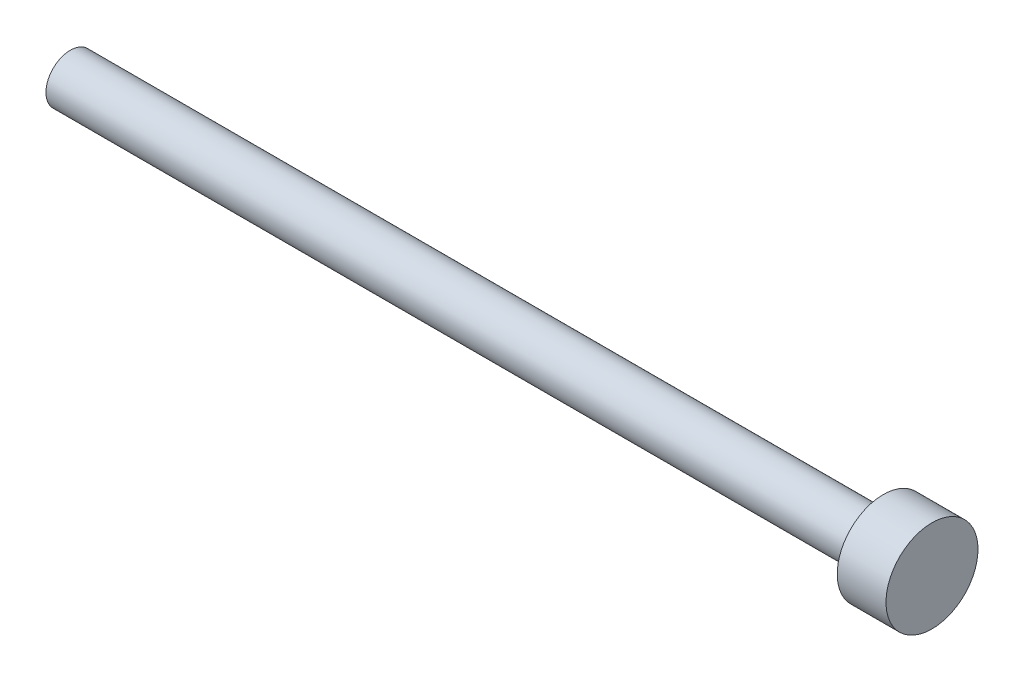
ISO-10303-21;
HEADER;
FILE_DESCRIPTION(('STEP AP214'),'2;1');
FILE_NAME('part.step','',(''),(''),'','','');
FILE_SCHEMA(('AUTOMOTIVE_DESIGN { 1 0 10303 214 1 1 1 1 }'));
ENDSEC;
DATA;
#1=APPLICATION_CONTEXT('core data for automotive mechanical design processes');
#2=APPLICATION_PROTOCOL_DEFINITION('international standard','automotive_design',2000,#1);
#3=PRODUCT_CONTEXT('',#1,'mechanical');
#4=PRODUCT('Part','Part','',(#3));
#5=PRODUCT_RELATED_PRODUCT_CATEGORY('part','',(#4));
#6=PRODUCT_DEFINITION_FORMATION('','',#4);
#7=PRODUCT_DEFINITION_CONTEXT('part definition',#1,'design');
#8=PRODUCT_DEFINITION('design','',#6,#7);
#9=PRODUCT_DEFINITION_SHAPE('','',#8);
#10=(LENGTH_UNIT() NAMED_UNIT(*) SI_UNIT(.MILLI.,.METRE.));
#11=(NAMED_UNIT(*) PLANE_ANGLE_UNIT() SI_UNIT($,.RADIAN.));
#12=(NAMED_UNIT(*) SI_UNIT($,.STERADIAN.) SOLID_ANGLE_UNIT());
#13=UNCERTAINTY_MEASURE_WITH_UNIT(LENGTH_MEASURE(1.E-05),#10,'distance_accuracy_value','');
#14=(GEOMETRIC_REPRESENTATION_CONTEXT(3) GLOBAL_UNCERTAINTY_ASSIGNED_CONTEXT((#13)) GLOBAL_UNIT_ASSIGNED_CONTEXT((#10,
#11,#12)) REPRESENTATION_CONTEXT('',''));
#15=CARTESIAN_POINT('',(0.,0.,0.));
#16=DIRECTION('',(0.,0.,1.));
#17=DIRECTION('',(1.,0.,0.));
#18=AXIS2_PLACEMENT_3D('',#15,#16,#17);
#19=CARTESIAN_POINT('',(50.,0.,0.));
#20=DIRECTION('',(-1.,0.,0.));
#21=DIRECTION('',(0.,0.,1.));
#22=AXIS2_PLACEMENT_3D('',#19,#20,#21);
#23=CYLINDRICAL_SURFACE('',#22,1.5);
#24=CARTESIAN_POINT('',(50.,0.,0.));
#25=DIRECTION('',(1.,0.,0.));
#26=DIRECTION('',(0.,0.,-1.));
#27=AXIS2_PLACEMENT_3D('',#24,#25,#26);
#28=CIRCLE('',#27,1.5);
#29=CARTESIAN_POINT('',(50.,0.,-1.5));
#30=VERTEX_POINT('',#29);
#31=EDGE_CURVE('E10',#30,#30,#28,.T.);
#32=ORIENTED_EDGE('',*,*,#31,.F.);
#33=EDGE_LOOP('',(#32));
#34=FACE_BOUND('',#33,.T.);
#35=CARTESIAN_POINT('',(0.,0.,0.));
#36=DIRECTION('',(1.,0.,0.));
#37=DIRECTION('',(0.,0.,-1.));
#38=AXIS2_PLACEMENT_3D('',#35,#36,#37);
#39=CIRCLE('',#38,1.5);
#40=CARTESIAN_POINT('',(0.,0.,-1.5));
#41=VERTEX_POINT('',#40);
#42=EDGE_CURVE('E38',#41,#41,#39,.T.);
#43=ORIENTED_EDGE('',*,*,#42,.T.);
#44=EDGE_LOOP('',(#43));
#45=FACE_BOUND('',#44,.T.);
#46=ADVANCED_FACE('F35',(#34,#45),#23,.T.);
#47=CARTESIAN_POINT('',(0.,0.,0.));
#48=DIRECTION('',(1.,0.,0.));
#49=DIRECTION('',(0.,0.,-1.));
#50=AXIS2_PLACEMENT_3D('',#47,#48,#49);
#51=PLANE('',#50);
#52=ORIENTED_EDGE('',*,*,#42,.F.);
#53=EDGE_LOOP('',(#52));
#54=FACE_BOUND('',#53,.T.);
#55=ADVANCED_FACE('F58',(#54),#51,.F.);
#56=CARTESIAN_POINT('',(53.,0.,0.));
#57=DIRECTION('',(-1.,0.,0.));
#58=DIRECTION('',(0.,0.,1.));
#59=AXIS2_PLACEMENT_3D('',#56,#57,#58);
#60=CYLINDRICAL_SURFACE('',#59,2.83);
#61=CARTESIAN_POINT('',(53.,0.,0.));
#62=DIRECTION('',(1.,0.,0.));
#63=DIRECTION('',(0.,0.,-1.));
#64=AXIS2_PLACEMENT_3D('',#61,#62,#63);
#65=CIRCLE('',#64,2.83);
#66=CARTESIAN_POINT('',(53.,0.,-2.83));
#67=VERTEX_POINT('',#66);
#68=EDGE_CURVE('E45',#67,#67,#65,.T.);
#69=ORIENTED_EDGE('',*,*,#68,.F.);
#70=EDGE_LOOP('',(#69));
#71=FACE_BOUND('',#70,.T.);
#72=CARTESIAN_POINT('',(50.,0.,0.));
#73=DIRECTION('',(1.,0.,0.));
#74=DIRECTION('',(0.,0.,-1.));
#75=AXIS2_PLACEMENT_3D('',#72,#73,#74);
#76=CIRCLE('',#75,2.83);
#77=CARTESIAN_POINT('',(50.,0.,-2.83));
#78=VERTEX_POINT('',#77);
#79=EDGE_CURVE('E47',#78,#78,#76,.T.);
#80=ORIENTED_EDGE('',*,*,#79,.T.);
#81=EDGE_LOOP('',(#80));
#82=FACE_BOUND('',#81,.T.);
#83=ADVANCED_FACE('F55',(#71,#82),#60,.T.);
#84=CARTESIAN_POINT('',(53.,0.,0.));
#85=DIRECTION('',(1.,0.,0.));
#86=DIRECTION('',(0.,0.,-1.));
#87=AXIS2_PLACEMENT_3D('',#84,#85,#86);
#88=PLANE('',#87);
#89=ORIENTED_EDGE('',*,*,#68,.T.);
#90=EDGE_LOOP('',(#89));
#91=FACE_BOUND('',#90,.T.);
#92=ADVANCED_FACE('F53',(#91),#88,.T.);
#93=CARTESIAN_POINT('',(50.,0.,0.));
#94=DIRECTION('',(1.,0.,0.));
#95=DIRECTION('',(0.,0.,-1.));
#96=AXIS2_PLACEMENT_3D('',#93,#94,#95);
#97=PLANE('',#96);
#98=ORIENTED_EDGE('',*,*,#31,.T.);
#99=EDGE_LOOP('',(#98));
#100=FACE_BOUND('',#99,.T.);
#101=ORIENTED_EDGE('',*,*,#79,.F.);
#102=EDGE_LOOP('',(#101));
#103=FACE_BOUND('',#102,.T.);
#104=ADVANCED_FACE('F62',(#100,#103),#97,.F.);
#105=CLOSED_SHELL('',(#46,#55,#83,#92,#104));
#106=MANIFOLD_SOLID_BREP('B2',#105);
#107=ADVANCED_BREP_SHAPE_REPRESENTATION('',(#18,#106),#14);
#108=SHAPE_DEFINITION_REPRESENTATION(#9,#107);
ENDSEC;
END-ISO-10303-21;
